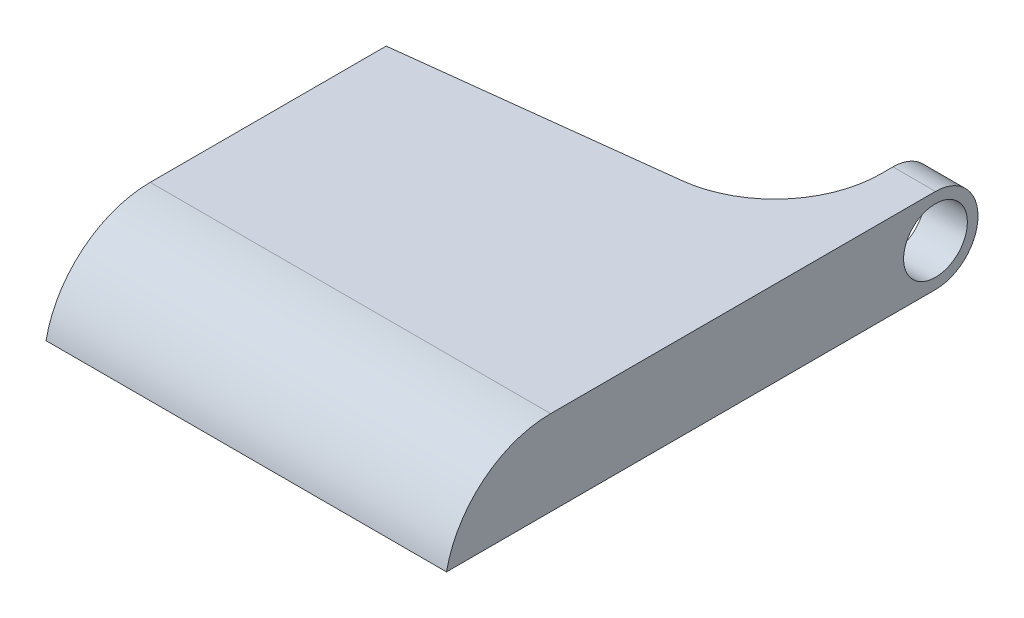
ISO-10303-21;
HEADER;
FILE_DESCRIPTION(('STEP AP214'),'2;1');
FILE_NAME('part.step','',(''),(''),'','','');
FILE_SCHEMA(('AUTOMOTIVE_DESIGN { 1 0 10303 214 1 1 1 1 }'));
ENDSEC;
DATA;
#1=APPLICATION_CONTEXT('core data for automotive mechanical design processes');
#2=APPLICATION_PROTOCOL_DEFINITION('international standard','automotive_design',2000,#1);
#3=PRODUCT_CONTEXT('',#1,'mechanical');
#4=PRODUCT('Part','Part','',(#3));
#5=PRODUCT_RELATED_PRODUCT_CATEGORY('part','',(#4));
#6=PRODUCT_DEFINITION_FORMATION('','',#4);
#7=PRODUCT_DEFINITION_CONTEXT('part definition',#1,'design');
#8=PRODUCT_DEFINITION('design','',#6,#7);
#9=PRODUCT_DEFINITION_SHAPE('','',#8);
#10=(LENGTH_UNIT() NAMED_UNIT(*) SI_UNIT(.MILLI.,.METRE.));
#11=(NAMED_UNIT(*) PLANE_ANGLE_UNIT() SI_UNIT($,.RADIAN.));
#12=(NAMED_UNIT(*) SI_UNIT($,.STERADIAN.) SOLID_ANGLE_UNIT());
#13=UNCERTAINTY_MEASURE_WITH_UNIT(LENGTH_MEASURE(1.E-05),#10,'distance_accuracy_value','');
#14=(GEOMETRIC_REPRESENTATION_CONTEXT(3) GLOBAL_UNCERTAINTY_ASSIGNED_CONTEXT((#13)) GLOBAL_UNIT_ASSIGNED_CONTEXT((#10,
#11,#12)) REPRESENTATION_CONTEXT('',''));
#15=CARTESIAN_POINT('',(0.,0.,0.));
#16=DIRECTION('',(0.,0.,1.));
#17=DIRECTION('',(1.,0.,0.));
#18=AXIS2_PLACEMENT_3D('',#15,#16,#17);
#19=CARTESIAN_POINT('',(18.84,4.,0.));
#20=DIRECTION('',(-1.,0.,0.));
#21=DIRECTION('',(0.,0.,1.));
#22=AXIS2_PLACEMENT_3D('',#19,#20,#21);
#23=PLANE('',#22);
#24=CARTESIAN_POINT('',(18.84,2.,-23.));
#25=DIRECTION('',(1.,0.,0.));
#26=DIRECTION('',(0.,0.,-1.));
#27=AXIS2_PLACEMENT_3D('',#24,#25,#26);
#28=CIRCLE('',#27,1.5);
#29=CARTESIAN_POINT('',(18.84,2.,-24.5));
#30=VERTEX_POINT('',#29);
#31=EDGE_CURVE('E146',#30,#30,#28,.T.);
#32=ORIENTED_EDGE('',*,*,#31,.F.);
#33=EDGE_LOOP('',(#32));
#34=FACE_BOUND('',#33,.T.);
#35=DIRECTION('',(0.,0.,-1.));
#36=VECTOR('',#35,1.);
#37=CARTESIAN_POINT('',(18.84,0.,0.));
#38=LINE('',#37,#36);
#39=CARTESIAN_POINT('',(18.84,0.,0.));
#40=VERTEX_POINT('',#39);
#41=CARTESIAN_POINT('',(18.84,0.,-23.));
#42=VERTEX_POINT('',#41);
#43=EDGE_CURVE('E151',#40,#42,#38,.T.);
#44=ORIENTED_EDGE('',*,*,#43,.T.);
#45=CARTESIAN_POINT('',(18.84,2.,-23.));
#46=DIRECTION('',(1.,0.,0.));
#47=DIRECTION('',(0.,0.,-1.));
#48=AXIS2_PLACEMENT_3D('',#45,#46,#47);
#49=CIRCLE('',#48,2.);
#50=CARTESIAN_POINT('',(18.84,4.,-23.));
#51=VERTEX_POINT('',#50);
#52=EDGE_CURVE('E139',#42,#51,#49,.T.);
#53=ORIENTED_EDGE('',*,*,#52,.T.);
#54=DIRECTION('',(0.,0.,-1.));
#55=VECTOR('',#54,1.);
#56=CARTESIAN_POINT('',(18.84,4.,0.));
#57=LINE('',#56,#55);
#58=CARTESIAN_POINT('',(18.84,4.,-4.89897948556636));
#59=VERTEX_POINT('',#58);
#60=EDGE_CURVE('E234',#59,#51,#57,.T.);
#61=ORIENTED_EDGE('',*,*,#60,.F.);
#62=CARTESIAN_POINT('',(18.84,-1.,-4.89897948556636));
#63=DIRECTION('',(-1.,0.,0.));
#64=DIRECTION('',(0.,0.,1.));
#65=AXIS2_PLACEMENT_3D('',#62,#63,#64);
#66=CIRCLE('',#65,5.);
#67=EDGE_CURVE('E155',#59,#40,#66,.F.);
#68=ORIENTED_EDGE('',*,*,#67,.T.);
#69=EDGE_LOOP('',(#44,#53,#61,#68));
#70=FACE_BOUND('',#69,.T.);
#71=ADVANCED_FACE('F75',(#34,#70),#23,.F.);
#72=CARTESIAN_POINT('',(16.84,4.,-25.));
#73=DIRECTION('',(1.,0.,0.));
#74=DIRECTION('',(0.,0.,-1.));
#75=AXIS2_PLACEMENT_3D('',#72,#73,#74);
#76=PLANE('',#75);
#77=CARTESIAN_POINT('',(16.84,2.,-23.));
#78=DIRECTION('',(1.,0.,0.));
#79=DIRECTION('',(0.,0.,-1.));
#80=AXIS2_PLACEMENT_3D('',#77,#78,#79);
#81=CIRCLE('',#80,2.);
#82=CARTESIAN_POINT('',(16.84,0.,-23.));
#83=VERTEX_POINT('',#82);
#84=CARTESIAN_POINT('',(16.84,4.,-23.));
#85=VERTEX_POINT('',#84);
#86=EDGE_CURVE('E91',#83,#85,#81,.T.);
#87=ORIENTED_EDGE('',*,*,#86,.F.);
#88=DIRECTION('',(0.,0.,1.));
#89=VECTOR('',#88,1.);
#90=CARTESIAN_POINT('',(16.84,0.,-25.));
#91=LINE('',#90,#89);
#92=CARTESIAN_POINT('',(16.84,0.,-22.4413150166989));
#93=VERTEX_POINT('',#92);
#94=EDGE_CURVE('E154',#83,#93,#91,.T.);
#95=ORIENTED_EDGE('',*,*,#94,.T.);
#96=DIRECTION('',(0.,-1.,0.));
#97=VECTOR('',#96,1.);
#98=CARTESIAN_POINT('',(16.84,4.,-22.4413150166989));
#99=LINE('',#98,#97);
#100=CARTESIAN_POINT('',(16.84,0.607925616414908,-22.4413150166989));
#101=VERTEX_POINT('',#100);
#102=EDGE_CURVE('E180',#93,#101,#99,.F.);
#103=ORIENTED_EDGE('',*,*,#102,.T.);
#104=CARTESIAN_POINT('',(16.84,2.,-23.));
#105=DIRECTION('',(1.,0.,0.));
#106=DIRECTION('',(0.,0.,-1.));
#107=AXIS2_PLACEMENT_3D('',#104,#105,#106);
#108=CIRCLE('',#107,1.5);
#109=CARTESIAN_POINT('',(16.84,3.39207438358509,-22.4413150166989));
#110=VERTEX_POINT('',#109);
#111=EDGE_CURVE('E98',#101,#110,#108,.T.);
#112=ORIENTED_EDGE('',*,*,#111,.T.);
#113=CARTESIAN_POINT('',(16.84,4.,-22.4413150166989));
#114=VERTEX_POINT('',#113);
#115=EDGE_CURVE('E179',#110,#114,#99,.F.);
#116=ORIENTED_EDGE('',*,*,#115,.T.);
#117=DIRECTION('',(0.,0.,1.));
#118=VECTOR('',#117,1.);
#119=CARTESIAN_POINT('',(16.84,4.,-25.));
#120=LINE('',#119,#118);
#121=EDGE_CURVE('E236',#85,#114,#120,.T.);
#122=ORIENTED_EDGE('',*,*,#121,.F.);
#123=EDGE_LOOP('',(#87,#95,#103,#112,#116,#122));
#124=FACE_BOUND('',#123,.T.);
#125=ADVANCED_FACE('F211',(#124),#76,.F.);
#126=CARTESIAN_POINT('',(0.,4.,-16.));
#127=DIRECTION('',(1.,0.,0.));
#128=DIRECTION('',(0.,0.,-1.));
#129=AXIS2_PLACEMENT_3D('',#126,#127,#128);
#130=PLANE('',#129);
#131=DIRECTION('',(0.,0.,1.));
#132=VECTOR('',#131,1.);
#133=CARTESIAN_POINT('',(0.,0.,-16.));
#134=LINE('',#133,#132);
#135=CARTESIAN_POINT('',(0.,0.,-16.));
#136=VERTEX_POINT('',#135);
#137=CARTESIAN_POINT('',(0.,0.,0.));
#138=VERTEX_POINT('',#137);
#139=EDGE_CURVE('E160',#136,#138,#134,.T.);
#140=ORIENTED_EDGE('',*,*,#139,.T.);
#141=CARTESIAN_POINT('',(0.,-1.,-4.89897948556636));
#142=DIRECTION('',(1.,0.,0.));
#143=DIRECTION('',(0.,0.,-1.));
#144=AXIS2_PLACEMENT_3D('',#141,#142,#143);
#145=CIRCLE('',#144,5.);
#146=CARTESIAN_POINT('',(0.,4.,-4.89897948556636));
#147=VERTEX_POINT('',#146);
#148=EDGE_CURVE('E174',#138,#147,#145,.F.);
#149=ORIENTED_EDGE('',*,*,#148,.T.);
#150=DIRECTION('',(0.,0.,1.));
#151=VECTOR('',#150,1.);
#152=CARTESIAN_POINT('',(0.,4.,-16.));
#153=LINE('',#152,#151);
#154=CARTESIAN_POINT('',(0.,4.,-16.));
#155=VERTEX_POINT('',#154);
#156=EDGE_CURVE('E165',#155,#147,#153,.T.);
#157=ORIENTED_EDGE('',*,*,#156,.F.);
#158=DIRECTION('',(0.,-1.,0.));
#159=VECTOR('',#158,1.);
#160=CARTESIAN_POINT('',(0.,4.,-16.));
#161=LINE('',#160,#159);
#162=EDGE_CURVE('E166',#155,#136,#161,.T.);
#163=ORIENTED_EDGE('',*,*,#162,.T.);
#164=EDGE_LOOP('',(#140,#149,#157,#163));
#165=FACE_BOUND('',#164,.T.);
#166=ADVANCED_FACE('F209',(#165),#130,.F.);
#167=CARTESIAN_POINT('',(16.84,4.,-18.));
#168=DIRECTION('',(0.117936009148176,0.,0.993021197027637));
#169=DIRECTION('',(0.993021197027637,0.,-0.117936009148176));
#170=AXIS2_PLACEMENT_3D('',#167,#168,#169);
#171=PLANE('',#170);
#172=DIRECTION('',(-0.993021197027637,0.,0.117936009148176));
#173=VECTOR('',#172,1.);
#174=CARTESIAN_POINT('',(16.84,4.,-18.));
#175=LINE('',#174,#173);
#176=CARTESIAN_POINT('',(12.4296800457409,4.,-17.4762090315607));
#177=VERTEX_POINT('',#176);
#178=EDGE_CURVE('E170',#177,#155,#175,.T.);
#179=ORIENTED_EDGE('',*,*,#178,.F.);
#180=DIRECTION('',(0.,-1.,0.));
#181=VECTOR('',#180,1.);
#182=CARTESIAN_POINT('',(12.4296800457409,0.,-17.4762090315607));
#183=LINE('',#182,#181);
#184=CARTESIAN_POINT('',(12.4296800457409,0.,-17.4762090315607));
#185=VERTEX_POINT('',#184);
#186=EDGE_CURVE('E176',#177,#185,#183,.T.);
#187=ORIENTED_EDGE('',*,*,#186,.T.);
#188=DIRECTION('',(-0.993021197027637,0.,0.117936009148176));
#189=VECTOR('',#188,1.);
#190=CARTESIAN_POINT('',(16.84,0.,-18.));
#191=LINE('',#190,#189);
#192=EDGE_CURVE('E158',#185,#136,#191,.T.);
#193=ORIENTED_EDGE('',*,*,#192,.T.);
#194=ORIENTED_EDGE('',*,*,#162,.F.);
#195=EDGE_LOOP('',(#179,#187,#193,#194));
#196=FACE_BOUND('',#195,.T.);
#197=ADVANCED_FACE('F202',(#196),#171,.F.);
#198=CARTESIAN_POINT('',(0.,4.,0.));
#199=DIRECTION('',(0.,1.,0.));
#200=DIRECTION('',(0.,0.,1.));
#201=AXIS2_PLACEMENT_3D('',#198,#199,#200);
#202=PLANE('',#201);
#203=DIRECTION('',(1.,0.,0.));
#204=VECTOR('',#203,1.);
#205=CARTESIAN_POINT('',(0.,4.,-23.));
#206=LINE('',#205,#204);
#207=EDGE_CURVE('E84',#85,#51,#206,.T.);
#208=ORIENTED_EDGE('',*,*,#207,.F.);
#209=ORIENTED_EDGE('',*,*,#121,.T.);
#210=CARTESIAN_POINT('',(11.84,4.,-22.4413150166989));
#211=DIRECTION('',(0.,1.,0.));
#212=DIRECTION('',(0.,0.,1.));
#213=AXIS2_PLACEMENT_3D('',#210,#211,#212);
#214=CIRCLE('',#213,5.);
#215=EDGE_CURVE('E185',#114,#177,#214,.F.);
#216=ORIENTED_EDGE('',*,*,#215,.T.);
#217=ORIENTED_EDGE('',*,*,#178,.T.);
#218=ORIENTED_EDGE('',*,*,#156,.T.);
#219=DIRECTION('',(-1.,0.,0.));
#220=VECTOR('',#219,1.);
#221=CARTESIAN_POINT('',(18.84,4.,-4.89897948556636));
#222=LINE('',#221,#220);
#223=EDGE_CURVE('E169',#147,#59,#222,.F.);
#224=ORIENTED_EDGE('',*,*,#223,.T.);
#225=ORIENTED_EDGE('',*,*,#60,.T.);
#226=EDGE_LOOP('',(#208,#209,#216,#217,#218,#224,#225));
#227=FACE_BOUND('',#226,.T.);
#228=ADVANCED_FACE('F199',(#227),#202,.T.);
#229=CARTESIAN_POINT('',(0.,0.,0.));
#230=DIRECTION('',(0.,1.,0.));
#231=DIRECTION('',(0.,0.,1.));
#232=AXIS2_PLACEMENT_3D('',#229,#230,#231);
#233=PLANE('',#232);
#234=ORIENTED_EDGE('',*,*,#94,.F.);
#235=DIRECTION('',(1.,0.,0.));
#236=VECTOR('',#235,1.);
#237=CARTESIAN_POINT('',(0.,0.,-23.));
#238=LINE('',#237,#236);
#239=EDGE_CURVE('E12',#83,#42,#238,.T.);
#240=ORIENTED_EDGE('',*,*,#239,.T.);
#241=ORIENTED_EDGE('',*,*,#43,.F.);
#242=DIRECTION('',(1.,0.,0.));
#243=VECTOR('',#242,1.);
#244=CARTESIAN_POINT('',(0.,0.,0.));
#245=LINE('',#244,#243);
#246=EDGE_CURVE('E156',#138,#40,#245,.T.);
#247=ORIENTED_EDGE('',*,*,#246,.F.);
#248=ORIENTED_EDGE('',*,*,#139,.F.);
#249=ORIENTED_EDGE('',*,*,#192,.F.);
#250=CARTESIAN_POINT('',(11.84,0.,-22.4413150166989));
#251=DIRECTION('',(0.,1.,0.));
#252=DIRECTION('',(0.,0.,1.));
#253=AXIS2_PLACEMENT_3D('',#250,#251,#252);
#254=CIRCLE('',#253,5.);
#255=EDGE_CURVE('E183',#185,#93,#254,.T.);
#256=ORIENTED_EDGE('',*,*,#255,.T.);
#257=EDGE_LOOP('',(#234,#240,#241,#247,#248,#249,#256));
#258=FACE_BOUND('',#257,.T.);
#259=ADVANCED_FACE('F150',(#258),#233,.F.);
#260=CARTESIAN_POINT('',(0.,-1.,-4.89897948556636));
#261=DIRECTION('',(1.,0.,0.));
#262=DIRECTION('',(0.,0.,-1.));
#263=AXIS2_PLACEMENT_3D('',#260,#261,#262);
#264=CYLINDRICAL_SURFACE('',#263,5.);
#265=ORIENTED_EDGE('',*,*,#148,.F.);
#266=ORIENTED_EDGE('',*,*,#246,.T.);
#267=ORIENTED_EDGE('',*,*,#67,.F.);
#268=ORIENTED_EDGE('',*,*,#223,.F.);
#269=EDGE_LOOP('',(#265,#266,#267,#268));
#270=FACE_BOUND('',#269,.T.);
#271=ADVANCED_FACE('F206',(#270),#264,.T.);
#272=CARTESIAN_POINT('',(11.84,4.,-22.4413150166989));
#273=DIRECTION('',(0.,1.,0.));
#274=DIRECTION('',(0.,0.,1.));
#275=AXIS2_PLACEMENT_3D('',#272,#273,#274);
#276=CYLINDRICAL_SURFACE('',#275,5.);
#277=ORIENTED_EDGE('',*,*,#115,.F.);
#278=CARTESIAN_POINT('',(16.84,3.39207438358509,-22.4413150166989));
#279=CARTESIAN_POINT('',(16.8400020303675,3.37648861714003,-22.4024788681501));
#280=CARTESIAN_POINT('',(16.8395471808406,3.35928426729932,-22.3643163773488));
#281=CARTESIAN_POINT('',(16.8378365776006,3.32176244811521,-22.2895823971455));
#282=CARTESIAN_POINT('',(16.8365809961034,3.30144564888962,-22.2530105674414));
#283=CARTESIAN_POINT('',(16.8317896146297,3.23610480421802,-22.1461907449704));
#284=CARTESIAN_POINT('',(16.8272281115321,3.18661530090449,-22.0786522231918));
#285=CARTESIAN_POINT('',(16.8164852531374,3.07723594025812,-21.9528515097737));
#286=CARTESIAN_POINT('',(16.810304247372,3.01734832805301,-21.8945873208434));
#287=CARTESIAN_POINT('',(16.7975247819622,2.88876085567525,-21.7887884587173));
#288=CARTESIAN_POINT('',(16.7909262603013,2.82005968479996,-21.7412553842996));
#289=CARTESIAN_POINT('',(16.7783822337673,2.67461890168257,-21.6576030574478));
#290=CARTESIAN_POINT('',(16.7724476626905,2.59777662097712,-21.6216604761807));
#291=CARTESIAN_POINT('',(16.7623767914756,2.43902956177807,-21.5631960213322));
#292=CARTESIAN_POINT('',(16.7582404179387,2.35712499007304,-21.5406735999527));
#293=CARTESIAN_POINT('',(16.7525009610442,2.19126762060234,-21.5098745853492));
#294=CARTESIAN_POINT('',(16.7508779090676,2.10733640566224,-21.501485652523));
#295=CARTESIAN_POINT('',(16.7503779180399,1.93924865179187,-21.4988760638574));
#296=CARTESIAN_POINT('',(16.7515008033914,1.85509212761347,-21.5046545020418));
#297=CARTESIAN_POINT('',(16.756268376353,1.6901284474556,-21.5300163608025));
#298=CARTESIAN_POINT('',(16.7598789799276,1.60929148250002,-21.5494132632821));
#299=CARTESIAN_POINT('',(16.7689890939344,1.45202107313184,-21.6012243726414));
#300=CARTESIAN_POINT('',(16.7744885992559,1.37558761680557,-21.6336385443012));
#301=CARTESIAN_POINT('',(16.7865272804083,1.22839272505738,-21.7109650684587));
#302=CARTESIAN_POINT('',(16.7930768348135,1.15769981153162,-21.7560059524483));
#303=CARTESIAN_POINT('',(16.80603210307,1.02474295368783,-21.8572628738431));
#304=CARTESIAN_POINT('',(16.8124377941354,0.962480336863603,-21.913480667811));
#305=CARTESIAN_POINT('',(16.8213247759903,0.873698850369852,-22.0082366737838));
#306=CARTESIAN_POINT('',(16.8242818007121,0.843627217258301,-22.0434709376575));
#307=CARTESIAN_POINT('',(16.8295800969682,0.786838305226169,-22.1166088576731));
#308=CARTESIAN_POINT('',(16.8319213279414,0.760121247324637,-22.1545126894452));
#309=CARTESIAN_POINT('',(16.8358020944043,0.710233650768242,-22.2327580498716));
#310=CARTESIAN_POINT('',(16.8373396034726,0.687072179552658,-22.2731054567325));
#311=CARTESIAN_POINT('',(16.8394410951785,0.644575818490677,-22.3558009666098));
#312=CARTESIAN_POINT('',(16.8400048839168,0.625241691470538,-22.3981494663838));
#313=CARTESIAN_POINT('',(16.84,0.607925616414909,-22.4413150166989));
#314=B_SPLINE_CURVE_WITH_KNOTS('',3,(#278,#279,#280,#281,#282,#283,#284,#285,#286,#287,#288,
#289,#290,#291,#292,#293,#294,#295,#296,#297,#298,#299,#300,#301,#302,#303,#304,#305,#306,#307,
#308,#309,#310,#311,#312,#313),.UNSPECIFIED.,.F.,.F.,(4,2,2,2,2,2,2,2,2,2,2,2,2,2,2,2,2,4),(0.,
0.125458534075264,0.250890094490966,0.501158857606693,0.751373650506785,1.00162569716632,
1.25552941440365,1.5094227668216,1.76128836578914,2.0131378588547,2.26160366098737,
2.51006879086501,2.7611611897447,3.01229308153011,3.15137048441829,3.29045704573683,
3.42989261440412,3.56935594599331),.UNSPECIFIED.);
#315=EDGE_CURVE('E187',#110,#101,#314,.T.);
#316=ORIENTED_EDGE('',*,*,#315,.T.);
#317=ORIENTED_EDGE('',*,*,#102,.F.);
#318=ORIENTED_EDGE('',*,*,#255,.F.);
#319=ORIENTED_EDGE('',*,*,#186,.F.);
#320=ORIENTED_EDGE('',*,*,#215,.F.);
#321=EDGE_LOOP('',(#277,#316,#317,#318,#319,#320));
#322=FACE_BOUND('',#321,.T.);
#323=ADVANCED_FACE('F77',(#322),#276,.F.);
#324=CARTESIAN_POINT('',(0.,2.,-23.));
#325=DIRECTION('',(1.,0.,0.));
#326=DIRECTION('',(0.,0.,-1.));
#327=AXIS2_PLACEMENT_3D('',#324,#325,#326);
#328=CYLINDRICAL_SURFACE('',#327,1.5);
#329=ORIENTED_EDGE('',*,*,#31,.T.);
#330=EDGE_LOOP('',(#329));
#331=FACE_BOUND('',#330,.T.);
#332=ORIENTED_EDGE('',*,*,#315,.F.);
#333=ORIENTED_EDGE('',*,*,#111,.F.);
#334=EDGE_LOOP('',(#332,#333));
#335=FACE_BOUND('',#334,.T.);
#336=ADVANCED_FACE('F193',(#331,#335),#328,.F.);
#337=CARTESIAN_POINT('',(0.,2.,-23.));
#338=DIRECTION('',(1.,0.,0.));
#339=DIRECTION('',(0.,0.,-1.));
#340=AXIS2_PLACEMENT_3D('',#337,#338,#339);
#341=CYLINDRICAL_SURFACE('',#340,2.);
#342=ORIENTED_EDGE('',*,*,#86,.T.);
#343=ORIENTED_EDGE('',*,*,#207,.T.);
#344=ORIENTED_EDGE('',*,*,#52,.F.);
#345=ORIENTED_EDGE('',*,*,#239,.F.);
#346=EDGE_LOOP('',(#342,#343,#344,#345));
#347=FACE_BOUND('',#346,.T.);
#348=ADVANCED_FACE('F140',(#347),#341,.T.);
#349=CLOSED_SHELL('',(#71,#125,#166,#197,#228,#259,#271,#323,#336,#348));
#350=MANIFOLD_SOLID_BREP('B2',#349);
#351=ADVANCED_BREP_SHAPE_REPRESENTATION('',(#18,#350),#14);
#352=SHAPE_DEFINITION_REPRESENTATION(#9,#351);
ENDSEC;
END-ISO-10303-21;
